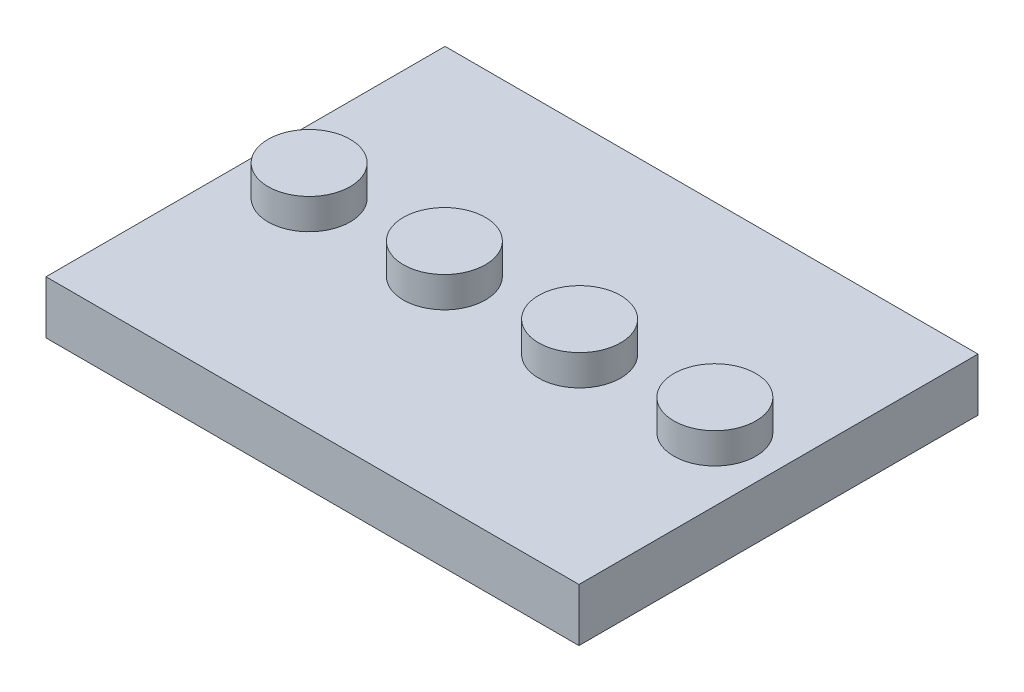
ISO-10303-21;
HEADER;
FILE_DESCRIPTION(('STEP AP214'),'2;1');
FILE_NAME('part.step','',(''),(''),'','','');
FILE_SCHEMA(('AUTOMOTIVE_DESIGN { 1 0 10303 214 1 1 1 1 }'));
ENDSEC;
DATA;
#1=APPLICATION_CONTEXT('core data for automotive mechanical design processes');
#2=APPLICATION_PROTOCOL_DEFINITION('international standard','automotive_design',2000,#1);
#3=PRODUCT_CONTEXT('',#1,'mechanical');
#4=PRODUCT('Part','Part','',(#3));
#5=PRODUCT_RELATED_PRODUCT_CATEGORY('part','',(#4));
#6=PRODUCT_DEFINITION_FORMATION('','',#4);
#7=PRODUCT_DEFINITION_CONTEXT('part definition',#1,'design');
#8=PRODUCT_DEFINITION('design','',#6,#7);
#9=PRODUCT_DEFINITION_SHAPE('','',#8);
#10=(LENGTH_UNIT() NAMED_UNIT(*) SI_UNIT(.MILLI.,.METRE.));
#11=(NAMED_UNIT(*) PLANE_ANGLE_UNIT() SI_UNIT($,.RADIAN.));
#12=(NAMED_UNIT(*) SI_UNIT($,.STERADIAN.) SOLID_ANGLE_UNIT());
#13=UNCERTAINTY_MEASURE_WITH_UNIT(LENGTH_MEASURE(1.E-05),#10,'distance_accuracy_value','');
#14=(GEOMETRIC_REPRESENTATION_CONTEXT(3) GLOBAL_UNCERTAINTY_ASSIGNED_CONTEXT((#13)) GLOBAL_UNIT_ASSIGNED_CONTEXT((#10,
#11,#12)) REPRESENTATION_CONTEXT('',''));
#15=CARTESIAN_POINT('',(0.,0.,0.));
#16=DIRECTION('',(0.,0.,1.));
#17=DIRECTION('',(1.,0.,0.));
#18=AXIS2_PLACEMENT_3D('',#15,#16,#17);
#19=CARTESIAN_POINT('',(15.94,-3.17,-11.935));
#20=DIRECTION('',(1.,0.,0.));
#21=DIRECTION('',(0.,0.,-1.));
#22=AXIS2_PLACEMENT_3D('',#19,#20,#21);
#23=PLANE('',#22);
#24=DIRECTION('',(0.,0.,-1.));
#25=VECTOR('',#24,1.);
#26=CARTESIAN_POINT('',(15.94,0.,-11.935));
#27=LINE('',#26,#25);
#28=CARTESIAN_POINT('',(15.94,0.,11.935));
#29=VERTEX_POINT('',#28);
#30=CARTESIAN_POINT('',(15.94,0.,-11.935));
#31=VERTEX_POINT('',#30);
#32=EDGE_CURVE('E195',#29,#31,#27,.T.);
#33=ORIENTED_EDGE('',*,*,#32,.F.);
#34=DIRECTION('',(0.,1.,0.));
#35=VECTOR('',#34,1.);
#36=CARTESIAN_POINT('',(15.94,-3.17,11.935));
#37=LINE('',#36,#35);
#38=CARTESIAN_POINT('',(15.94,-3.17,11.935));
#39=VERTEX_POINT('',#38);
#40=EDGE_CURVE('E58',#39,#29,#37,.T.);
#41=ORIENTED_EDGE('',*,*,#40,.F.);
#42=DIRECTION('',(0.,0.,-1.));
#43=VECTOR('',#42,1.);
#44=CARTESIAN_POINT('',(15.94,-3.17,-11.935));
#45=LINE('',#44,#43);
#46=CARTESIAN_POINT('',(15.94,-3.17,-11.935));
#47=VERTEX_POINT('',#46);
#48=EDGE_CURVE('E198',#39,#47,#45,.T.);
#49=ORIENTED_EDGE('',*,*,#48,.T.);
#50=DIRECTION('',(0.,1.,0.));
#51=VECTOR('',#50,1.);
#52=CARTESIAN_POINT('',(15.94,-3.17,-11.935));
#53=LINE('',#52,#51);
#54=EDGE_CURVE('E84',#47,#31,#53,.T.);
#55=ORIENTED_EDGE('',*,*,#54,.T.);
#56=EDGE_LOOP('',(#33,#41,#49,#55));
#57=FACE_BOUND('',#56,.T.);
#58=ADVANCED_FACE('F35',(#57),#23,.T.);
#59=CARTESIAN_POINT('',(-15.94,-3.17,11.935));
#60=DIRECTION('',(0.,0.,1.));
#61=DIRECTION('',(1.,0.,0.));
#62=AXIS2_PLACEMENT_3D('',#59,#60,#61);
#63=PLANE('',#62);
#64=DIRECTION('',(1.,0.,0.));
#65=VECTOR('',#64,1.);
#66=CARTESIAN_POINT('',(-15.94,0.,11.935));
#67=LINE('',#66,#65);
#68=CARTESIAN_POINT('',(-15.94,0.,11.935));
#69=VERTEX_POINT('',#68);
#70=EDGE_CURVE('E201',#69,#29,#67,.T.);
#71=ORIENTED_EDGE('',*,*,#70,.F.);
#72=DIRECTION('',(0.,1.,0.));
#73=VECTOR('',#72,1.);
#74=CARTESIAN_POINT('',(-15.94,-3.17,11.935));
#75=LINE('',#74,#73);
#76=CARTESIAN_POINT('',(-15.94,-3.17,11.935));
#77=VERTEX_POINT('',#76);
#78=EDGE_CURVE('E220',#77,#69,#75,.T.);
#79=ORIENTED_EDGE('',*,*,#78,.F.);
#80=DIRECTION('',(1.,0.,0.));
#81=VECTOR('',#80,1.);
#82=CARTESIAN_POINT('',(-15.94,-3.17,11.935));
#83=LINE('',#82,#81);
#84=EDGE_CURVE('E206',#77,#39,#83,.T.);
#85=ORIENTED_EDGE('',*,*,#84,.T.);
#86=ORIENTED_EDGE('',*,*,#40,.T.);
#87=EDGE_LOOP('',(#71,#79,#85,#86));
#88=FACE_BOUND('',#87,.T.);
#89=ADVANCED_FACE('F276',(#88),#63,.T.);
#90=CARTESIAN_POINT('',(-15.94,-3.17,-11.935));
#91=DIRECTION('',(-1.,0.,0.));
#92=DIRECTION('',(0.,0.,1.));
#93=AXIS2_PLACEMENT_3D('',#90,#91,#92);
#94=PLANE('',#93);
#95=DIRECTION('',(0.,0.,1.));
#96=VECTOR('',#95,1.);
#97=CARTESIAN_POINT('',(-15.94,0.,-11.935));
#98=LINE('',#97,#96);
#99=CARTESIAN_POINT('',(-15.94,0.,-11.935));
#100=VERTEX_POINT('',#99);
#101=EDGE_CURVE('E213',#100,#69,#98,.T.);
#102=ORIENTED_EDGE('',*,*,#101,.F.);
#103=DIRECTION('',(0.,1.,0.));
#104=VECTOR('',#103,1.);
#105=CARTESIAN_POINT('',(-15.94,-3.17,-11.935));
#106=LINE('',#105,#104);
#107=CARTESIAN_POINT('',(-15.94,-3.17,-11.935));
#108=VERTEX_POINT('',#107);
#109=EDGE_CURVE('E222',#108,#100,#106,.T.);
#110=ORIENTED_EDGE('',*,*,#109,.F.);
#111=DIRECTION('',(0.,0.,1.));
#112=VECTOR('',#111,1.);
#113=CARTESIAN_POINT('',(-15.94,-3.17,-11.935));
#114=LINE('',#113,#112);
#115=EDGE_CURVE('E203',#108,#77,#114,.T.);
#116=ORIENTED_EDGE('',*,*,#115,.T.);
#117=ORIENTED_EDGE('',*,*,#78,.T.);
#118=EDGE_LOOP('',(#102,#110,#116,#117));
#119=FACE_BOUND('',#118,.T.);
#120=ADVANCED_FACE('F280',(#119),#94,.T.);
#121=CARTESIAN_POINT('',(-15.94,-3.17,-11.935));
#122=DIRECTION('',(0.,0.,-1.));
#123=DIRECTION('',(-1.,0.,0.));
#124=AXIS2_PLACEMENT_3D('',#121,#122,#123);
#125=PLANE('',#124);
#126=DIRECTION('',(-1.,0.,0.));
#127=VECTOR('',#126,1.);
#128=CARTESIAN_POINT('',(-15.94,0.,-11.935));
#129=LINE('',#128,#127);
#130=EDGE_CURVE('E210',#31,#100,#129,.T.);
#131=ORIENTED_EDGE('',*,*,#130,.F.);
#132=ORIENTED_EDGE('',*,*,#54,.F.);
#133=DIRECTION('',(-1.,0.,0.));
#134=VECTOR('',#133,1.);
#135=CARTESIAN_POINT('',(-15.94,-3.17,-11.935));
#136=LINE('',#135,#134);
#137=EDGE_CURVE('E200',#47,#108,#136,.T.);
#138=ORIENTED_EDGE('',*,*,#137,.T.);
#139=ORIENTED_EDGE('',*,*,#109,.T.);
#140=EDGE_LOOP('',(#131,#132,#138,#139));
#141=FACE_BOUND('',#140,.T.);
#142=ADVANCED_FACE('F290',(#141),#125,.T.);
#143=CARTESIAN_POINT('',(0.,-3.17,0.));
#144=DIRECTION('',(0.,1.,0.));
#145=DIRECTION('',(0.,0.,1.));
#146=AXIS2_PLACEMENT_3D('',#143,#144,#145);
#147=PLANE('',#146);
#148=DIRECTION('',(1.,0.,0.));
#149=VECTOR('',#148,1.);
#150=CARTESIAN_POINT('',(0.,-3.17,10.435));
#151=LINE('',#150,#149);
#152=CARTESIAN_POINT('',(-14.44,-3.17,10.435));
#153=VERTEX_POINT('',#152);
#154=CARTESIAN_POINT('',(14.44,-3.17,10.435));
#155=VERTEX_POINT('',#154);
#156=EDGE_CURVE('E169',#153,#155,#151,.T.);
#157=ORIENTED_EDGE('',*,*,#156,.T.);
#158=DIRECTION('',(0.,0.,-1.));
#159=VECTOR('',#158,1.);
#160=CARTESIAN_POINT('',(14.44,-3.17,0.));
#161=LINE('',#160,#159);
#162=CARTESIAN_POINT('',(14.44,-3.17,-10.435));
#163=VERTEX_POINT('',#162);
#164=EDGE_CURVE('E113',#155,#163,#161,.T.);
#165=ORIENTED_EDGE('',*,*,#164,.T.);
#166=DIRECTION('',(-1.,0.,0.));
#167=VECTOR('',#166,1.);
#168=CARTESIAN_POINT('',(0.,-3.17,-10.435));
#169=LINE('',#168,#167);
#170=CARTESIAN_POINT('',(-14.44,-3.17,-10.435));
#171=VERTEX_POINT('',#170);
#172=EDGE_CURVE('E135',#163,#171,#169,.T.);
#173=ORIENTED_EDGE('',*,*,#172,.T.);
#174=DIRECTION('',(0.,0.,1.));
#175=VECTOR('',#174,1.);
#176=CARTESIAN_POINT('',(-14.44,-3.17,0.));
#177=LINE('',#176,#175);
#178=EDGE_CURVE('E49',#171,#153,#177,.T.);
#179=ORIENTED_EDGE('',*,*,#178,.T.);
#180=EDGE_LOOP('',(#157,#165,#173,#179));
#181=FACE_BOUND('',#180,.T.);
#182=ORIENTED_EDGE('',*,*,#48,.F.);
#183=ORIENTED_EDGE('',*,*,#84,.F.);
#184=ORIENTED_EDGE('',*,*,#115,.F.);
#185=ORIENTED_EDGE('',*,*,#137,.F.);
#186=EDGE_LOOP('',(#182,#183,#184,#185));
#187=FACE_BOUND('',#186,.T.);
#188=ADVANCED_FACE('F289',(#181,#187),#147,.F.);
#189=CARTESIAN_POINT('',(0.,0.,0.));
#190=DIRECTION('',(0.,1.,0.));
#191=DIRECTION('',(0.,0.,1.));
#192=AXIS2_PLACEMENT_3D('',#189,#190,#191);
#193=PLANE('',#192);
#194=CARTESIAN_POINT('',(12.135,0.,0.));
#195=DIRECTION('',(0.,1.,0.));
#196=DIRECTION('',(0.,0.,1.));
#197=AXIS2_PLACEMENT_3D('',#194,#195,#196);
#198=CIRCLE('',#197,2.455);
#199=CARTESIAN_POINT('',(12.135,0.,2.455));
#200=VERTEX_POINT('',#199);
#201=EDGE_CURVE('E118',#200,#200,#198,.T.);
#202=ORIENTED_EDGE('',*,*,#201,.F.);
#203=EDGE_LOOP('',(#202));
#204=FACE_BOUND('',#203,.T.);
#205=CARTESIAN_POINT('',(4.045,0.,0.));
#206=DIRECTION('',(0.,1.,0.));
#207=DIRECTION('',(0.,0.,1.));
#208=AXIS2_PLACEMENT_3D('',#205,#206,#207);
#209=CIRCLE('',#208,2.455);
#210=CARTESIAN_POINT('',(4.045,0.,2.455));
#211=VERTEX_POINT('',#210);
#212=EDGE_CURVE('E177',#211,#211,#209,.T.);
#213=ORIENTED_EDGE('',*,*,#212,.F.);
#214=EDGE_LOOP('',(#213));
#215=FACE_BOUND('',#214,.T.);
#216=CARTESIAN_POINT('',(-4.045,0.,0.));
#217=DIRECTION('',(0.,1.,0.));
#218=DIRECTION('',(0.,0.,1.));
#219=AXIS2_PLACEMENT_3D('',#216,#217,#218);
#220=CIRCLE('',#219,2.455);
#221=CARTESIAN_POINT('',(-4.045,0.,2.455));
#222=VERTEX_POINT('',#221);
#223=EDGE_CURVE('E183',#222,#222,#220,.T.);
#224=ORIENTED_EDGE('',*,*,#223,.F.);
#225=EDGE_LOOP('',(#224));
#226=FACE_BOUND('',#225,.T.);
#227=CARTESIAN_POINT('',(-12.135,0.,0.));
#228=DIRECTION('',(0.,1.,0.));
#229=DIRECTION('',(0.,0.,1.));
#230=AXIS2_PLACEMENT_3D('',#227,#228,#229);
#231=CIRCLE('',#230,2.455);
#232=CARTESIAN_POINT('',(-12.135,0.,2.455));
#233=VERTEX_POINT('',#232);
#234=EDGE_CURVE('E189',#233,#233,#231,.T.);
#235=ORIENTED_EDGE('',*,*,#234,.F.);
#236=EDGE_LOOP('',(#235));
#237=FACE_BOUND('',#236,.T.);
#238=ORIENTED_EDGE('',*,*,#32,.T.);
#239=ORIENTED_EDGE('',*,*,#130,.T.);
#240=ORIENTED_EDGE('',*,*,#101,.T.);
#241=ORIENTED_EDGE('',*,*,#70,.T.);
#242=EDGE_LOOP('',(#238,#239,#240,#241));
#243=FACE_BOUND('',#242,.T.);
#244=ADVANCED_FACE('F283',(#204,#215,#226,#237,#243),#193,.T.);
#245=CARTESIAN_POINT('',(-12.135,1.83,0.));
#246=DIRECTION('',(0.,-1.,0.));
#247=DIRECTION('',(0.,0.,-1.));
#248=AXIS2_PLACEMENT_3D('',#245,#246,#247);
#249=CYLINDRICAL_SURFACE('',#248,2.455);
#250=CARTESIAN_POINT('',(-12.135,1.83,0.));
#251=DIRECTION('',(0.,1.,0.));
#252=DIRECTION('',(0.,0.,1.));
#253=AXIS2_PLACEMENT_3D('',#250,#251,#252);
#254=CIRCLE('',#253,2.455);
#255=CARTESIAN_POINT('',(-12.135,1.83,2.455));
#256=VERTEX_POINT('',#255);
#257=EDGE_CURVE('E192',#256,#256,#254,.T.);
#258=ORIENTED_EDGE('',*,*,#257,.F.);
#259=EDGE_LOOP('',(#258));
#260=FACE_BOUND('',#259,.T.);
#261=ORIENTED_EDGE('',*,*,#234,.T.);
#262=EDGE_LOOP('',(#261));
#263=FACE_BOUND('',#262,.T.);
#264=ADVANCED_FACE('F301',(#260,#263),#249,.T.);
#265=CARTESIAN_POINT('',(-12.135,1.83,0.));
#266=DIRECTION('',(0.,1.,0.));
#267=DIRECTION('',(0.,0.,1.));
#268=AXIS2_PLACEMENT_3D('',#265,#266,#267);
#269=PLANE('',#268);
#270=ORIENTED_EDGE('',*,*,#257,.T.);
#271=EDGE_LOOP('',(#270));
#272=FACE_BOUND('',#271,.T.);
#273=ADVANCED_FACE('F306',(#272),#269,.T.);
#274=CARTESIAN_POINT('',(-4.045,1.83,0.));
#275=DIRECTION('',(0.,-1.,0.));
#276=DIRECTION('',(0.,0.,-1.));
#277=AXIS2_PLACEMENT_3D('',#274,#275,#276);
#278=CYLINDRICAL_SURFACE('',#277,2.455);
#279=CARTESIAN_POINT('',(-4.045,1.83,0.));
#280=DIRECTION('',(0.,1.,0.));
#281=DIRECTION('',(0.,0.,1.));
#282=AXIS2_PLACEMENT_3D('',#279,#280,#281);
#283=CIRCLE('',#282,2.455);
#284=CARTESIAN_POINT('',(-4.045,1.83,2.455));
#285=VERTEX_POINT('',#284);
#286=EDGE_CURVE('E186',#285,#285,#283,.T.);
#287=ORIENTED_EDGE('',*,*,#286,.F.);
#288=EDGE_LOOP('',(#287));
#289=FACE_BOUND('',#288,.T.);
#290=ORIENTED_EDGE('',*,*,#223,.T.);
#291=EDGE_LOOP('',(#290));
#292=FACE_BOUND('',#291,.T.);
#293=ADVANCED_FACE('F310',(#289,#292),#278,.T.);
#294=CARTESIAN_POINT('',(-4.045,1.83,0.));
#295=DIRECTION('',(0.,1.,0.));
#296=DIRECTION('',(0.,0.,1.));
#297=AXIS2_PLACEMENT_3D('',#294,#295,#296);
#298=PLANE('',#297);
#299=ORIENTED_EDGE('',*,*,#286,.T.);
#300=EDGE_LOOP('',(#299));
#301=FACE_BOUND('',#300,.T.);
#302=ADVANCED_FACE('F314',(#301),#298,.T.);
#303=CARTESIAN_POINT('',(4.045,1.83,0.));
#304=DIRECTION('',(0.,-1.,0.));
#305=DIRECTION('',(0.,0.,-1.));
#306=AXIS2_PLACEMENT_3D('',#303,#304,#305);
#307=CYLINDRICAL_SURFACE('',#306,2.455);
#308=CARTESIAN_POINT('',(4.045,1.83,0.));
#309=DIRECTION('',(0.,1.,0.));
#310=DIRECTION('',(0.,0.,1.));
#311=AXIS2_PLACEMENT_3D('',#308,#309,#310);
#312=CIRCLE('',#311,2.455);
#313=CARTESIAN_POINT('',(4.045,1.83,2.455));
#314=VERTEX_POINT('',#313);
#315=EDGE_CURVE('E180',#314,#314,#312,.T.);
#316=ORIENTED_EDGE('',*,*,#315,.F.);
#317=EDGE_LOOP('',(#316));
#318=FACE_BOUND('',#317,.T.);
#319=ORIENTED_EDGE('',*,*,#212,.T.);
#320=EDGE_LOOP('',(#319));
#321=FACE_BOUND('',#320,.T.);
#322=ADVANCED_FACE('F318',(#318,#321),#307,.T.);
#323=CARTESIAN_POINT('',(4.045,1.83,0.));
#324=DIRECTION('',(0.,1.,0.));
#325=DIRECTION('',(0.,0.,1.));
#326=AXIS2_PLACEMENT_3D('',#323,#324,#325);
#327=PLANE('',#326);
#328=ORIENTED_EDGE('',*,*,#315,.T.);
#329=EDGE_LOOP('',(#328));
#330=FACE_BOUND('',#329,.T.);
#331=ADVANCED_FACE('F322',(#330),#327,.T.);
#332=CARTESIAN_POINT('',(12.135,1.83,0.));
#333=DIRECTION('',(0.,-1.,0.));
#334=DIRECTION('',(0.,0.,-1.));
#335=AXIS2_PLACEMENT_3D('',#332,#333,#334);
#336=CYLINDRICAL_SURFACE('',#335,2.455);
#337=CARTESIAN_POINT('',(12.135,1.83,0.));
#338=DIRECTION('',(0.,1.,0.));
#339=DIRECTION('',(0.,0.,1.));
#340=AXIS2_PLACEMENT_3D('',#337,#338,#339);
#341=CIRCLE('',#340,2.455);
#342=CARTESIAN_POINT('',(12.135,1.83,2.455));
#343=VERTEX_POINT('',#342);
#344=EDGE_CURVE('E174',#343,#343,#341,.T.);
#345=ORIENTED_EDGE('',*,*,#344,.F.);
#346=EDGE_LOOP('',(#345));
#347=FACE_BOUND('',#346,.T.);
#348=ORIENTED_EDGE('',*,*,#201,.T.);
#349=EDGE_LOOP('',(#348));
#350=FACE_BOUND('',#349,.T.);
#351=ADVANCED_FACE('F326',(#347,#350),#336,.T.);
#352=CARTESIAN_POINT('',(12.135,1.83,0.));
#353=DIRECTION('',(0.,1.,0.));
#354=DIRECTION('',(0.,0.,1.));
#355=AXIS2_PLACEMENT_3D('',#352,#353,#354);
#356=PLANE('',#355);
#357=ORIENTED_EDGE('',*,*,#344,.T.);
#358=EDGE_LOOP('',(#357));
#359=FACE_BOUND('',#358,.T.);
#360=ADVANCED_FACE('F330',(#359),#356,.T.);
#361=CARTESIAN_POINT('',(14.44,-3.17,-11.935));
#362=DIRECTION('',(1.,0.,0.));
#363=DIRECTION('',(0.,0.,-1.));
#364=AXIS2_PLACEMENT_3D('',#361,#362,#363);
#365=PLANE('',#364);
#366=DIRECTION('',(0.,0.,-1.));
#367=VECTOR('',#366,1.);
#368=CARTESIAN_POINT('',(14.44,-1.5,0.));
#369=LINE('',#368,#367);
#370=CARTESIAN_POINT('',(14.44,-1.5,10.435));
#371=VERTEX_POINT('',#370);
#372=CARTESIAN_POINT('',(14.44,-1.5,-10.435));
#373=VERTEX_POINT('',#372);
#374=EDGE_CURVE('E111',#371,#373,#369,.T.);
#375=ORIENTED_EDGE('',*,*,#374,.T.);
#376=DIRECTION('',(0.,1.,0.));
#377=VECTOR('',#376,1.);
#378=CARTESIAN_POINT('',(14.44,-3.17,-10.435));
#379=LINE('',#378,#377);
#380=EDGE_CURVE('E140',#163,#373,#379,.T.);
#381=ORIENTED_EDGE('',*,*,#380,.F.);
#382=ORIENTED_EDGE('',*,*,#164,.F.);
#383=DIRECTION('',(0.,1.,0.));
#384=VECTOR('',#383,1.);
#385=CARTESIAN_POINT('',(14.44,-3.17,10.435));
#386=LINE('',#385,#384);
#387=EDGE_CURVE('E108',#155,#371,#386,.T.);
#388=ORIENTED_EDGE('',*,*,#387,.T.);
#389=EDGE_LOOP('',(#375,#381,#382,#388));
#390=FACE_BOUND('',#389,.T.);
#391=ADVANCED_FACE('F110',(#390),#365,.F.);
#392=CARTESIAN_POINT('',(-15.94,-3.17,10.435));
#393=DIRECTION('',(0.,0.,1.));
#394=DIRECTION('',(1.,0.,0.));
#395=AXIS2_PLACEMENT_3D('',#392,#393,#394);
#396=PLANE('',#395);
#397=DIRECTION('',(1.,0.,0.));
#398=VECTOR('',#397,1.);
#399=CARTESIAN_POINT('',(0.,-1.5,10.435));
#400=LINE('',#399,#398);
#401=CARTESIAN_POINT('',(-14.44,-1.5,10.435));
#402=VERTEX_POINT('',#401);
#403=EDGE_CURVE('E126',#402,#371,#400,.T.);
#404=ORIENTED_EDGE('',*,*,#403,.T.);
#405=ORIENTED_EDGE('',*,*,#387,.F.);
#406=ORIENTED_EDGE('',*,*,#156,.F.);
#407=DIRECTION('',(0.,1.,0.));
#408=VECTOR('',#407,1.);
#409=CARTESIAN_POINT('',(-14.44,-3.17,10.435));
#410=LINE('',#409,#408);
#411=EDGE_CURVE('E119',#153,#402,#410,.T.);
#412=ORIENTED_EDGE('',*,*,#411,.T.);
#413=EDGE_LOOP('',(#404,#405,#406,#412));
#414=FACE_BOUND('',#413,.T.);
#415=ADVANCED_FACE('F131',(#414),#396,.F.);
#416=CARTESIAN_POINT('',(-14.44,-3.17,-11.935));
#417=DIRECTION('',(-1.,0.,0.));
#418=DIRECTION('',(0.,0.,1.));
#419=AXIS2_PLACEMENT_3D('',#416,#417,#418);
#420=PLANE('',#419);
#421=DIRECTION('',(0.,0.,1.));
#422=VECTOR('',#421,1.);
#423=CARTESIAN_POINT('',(-14.44,-1.5,0.));
#424=LINE('',#423,#422);
#425=CARTESIAN_POINT('',(-14.44,-1.5,-10.435));
#426=VERTEX_POINT('',#425);
#427=EDGE_CURVE('E133',#426,#402,#424,.T.);
#428=ORIENTED_EDGE('',*,*,#427,.T.);
#429=ORIENTED_EDGE('',*,*,#411,.F.);
#430=ORIENTED_EDGE('',*,*,#178,.F.);
#431=DIRECTION('',(0.,1.,0.));
#432=VECTOR('',#431,1.);
#433=CARTESIAN_POINT('',(-14.44,-3.17,-10.435));
#434=LINE('',#433,#432);
#435=EDGE_CURVE('E141',#171,#426,#434,.T.);
#436=ORIENTED_EDGE('',*,*,#435,.T.);
#437=EDGE_LOOP('',(#428,#429,#430,#436));
#438=FACE_BOUND('',#437,.T.);
#439=ADVANCED_FACE('F618',(#438),#420,.F.);
#440=CARTESIAN_POINT('',(-15.94,-3.17,-10.435));
#441=DIRECTION('',(0.,0.,-1.));
#442=DIRECTION('',(-1.,0.,0.));
#443=AXIS2_PLACEMENT_3D('',#440,#441,#442);
#444=PLANE('',#443);
#445=DIRECTION('',(-1.,0.,0.));
#446=VECTOR('',#445,1.);
#447=CARTESIAN_POINT('',(0.,-1.5,-10.435));
#448=LINE('',#447,#446);
#449=EDGE_CURVE('E128',#373,#426,#448,.T.);
#450=ORIENTED_EDGE('',*,*,#449,.T.);
#451=ORIENTED_EDGE('',*,*,#435,.F.);
#452=ORIENTED_EDGE('',*,*,#172,.F.);
#453=ORIENTED_EDGE('',*,*,#380,.T.);
#454=EDGE_LOOP('',(#450,#451,#452,#453));
#455=FACE_BOUND('',#454,.T.);
#456=ADVANCED_FACE('F243',(#455),#444,.F.);
#457=CARTESIAN_POINT('',(0.,-1.5,0.));
#458=DIRECTION('',(0.,1.,0.));
#459=DIRECTION('',(0.,0.,1.));
#460=AXIS2_PLACEMENT_3D('',#457,#458,#459);
#461=PLANE('',#460);
#462=CARTESIAN_POINT('',(-7.96999999999999,-1.5,-3.98166666666666));
#463=DIRECTION('',(0.,1.,0.));
#464=DIRECTION('',(0.,0.,1.));
#465=AXIS2_PLACEMENT_3D('',#462,#463,#464);
#466=CIRCLE('',#465,3.24);
#467=CARTESIAN_POINT('',(-7.96999999999999,-1.5,-0.741666666666664));
#468=VERTEX_POINT('',#467);
#469=EDGE_CURVE('E12',#468,#468,#466,.F.);
#470=ORIENTED_EDGE('',*,*,#469,.F.);
#471=EDGE_LOOP('',(#470));
#472=FACE_BOUND('',#471,.T.);
#473=CARTESIAN_POINT('',(7.97000000000001,-1.5,-3.98166666666666));
#474=DIRECTION('',(0.,1.,0.));
#475=DIRECTION('',(0.,0.,1.));
#476=AXIS2_PLACEMENT_3D('',#473,#474,#475);
#477=CIRCLE('',#476,3.24);
#478=CARTESIAN_POINT('',(7.97000000000001,-1.5,-0.741666666666664));
#479=VERTEX_POINT('',#478);
#480=EDGE_CURVE('E42',#479,#479,#477,.F.);
#481=ORIENTED_EDGE('',*,*,#480,.F.);
#482=EDGE_LOOP('',(#481));
#483=FACE_BOUND('',#482,.T.);
#484=CARTESIAN_POINT('',(0.,-1.5,-3.98166666666666));
#485=DIRECTION('',(0.,1.,0.));
#486=DIRECTION('',(0.,0.,1.));
#487=AXIS2_PLACEMENT_3D('',#484,#485,#486);
#488=CIRCLE('',#487,3.24);
#489=CARTESIAN_POINT('',(0.,-1.5,-0.741666666666664));
#490=VERTEX_POINT('',#489);
#491=EDGE_CURVE('E233',#490,#490,#488,.F.);
#492=ORIENTED_EDGE('',*,*,#491,.F.);
#493=EDGE_LOOP('',(#492));
#494=FACE_BOUND('',#493,.T.);
#495=CARTESIAN_POINT('',(7.97000000000001,-1.5,3.97833333333334));
#496=DIRECTION('',(0.,1.,0.));
#497=DIRECTION('',(0.,0.,1.));
#498=AXIS2_PLACEMENT_3D('',#495,#496,#497);
#499=CIRCLE('',#498,3.24);
#500=CARTESIAN_POINT('',(7.97000000000001,-1.5,7.21833333333334));
#501=VERTEX_POINT('',#500);
#502=EDGE_CURVE('E230',#501,#501,#499,.F.);
#503=ORIENTED_EDGE('',*,*,#502,.F.);
#504=EDGE_LOOP('',(#503));
#505=FACE_BOUND('',#504,.T.);
#506=CARTESIAN_POINT('',(0.,-1.5,3.97833333333334));
#507=DIRECTION('',(0.,1.,0.));
#508=DIRECTION('',(0.,0.,1.));
#509=AXIS2_PLACEMENT_3D('',#506,#507,#508);
#510=CIRCLE('',#509,3.24);
#511=CARTESIAN_POINT('',(0.,-1.5,7.21833333333334));
#512=VERTEX_POINT('',#511);
#513=EDGE_CURVE('E227',#512,#512,#510,.F.);
#514=ORIENTED_EDGE('',*,*,#513,.F.);
#515=EDGE_LOOP('',(#514));
#516=FACE_BOUND('',#515,.T.);
#517=CARTESIAN_POINT('',(-7.96999999999999,-1.5,3.97833333333334));
#518=DIRECTION('',(0.,1.,0.));
#519=DIRECTION('',(0.,0.,1.));
#520=AXIS2_PLACEMENT_3D('',#517,#518,#519);
#521=CIRCLE('',#520,3.24);
#522=CARTESIAN_POINT('',(-7.96999999999999,-1.5,7.21833333333334));
#523=VERTEX_POINT('',#522);
#524=EDGE_CURVE('E219',#523,#523,#521,.F.);
#525=ORIENTED_EDGE('',*,*,#524,.F.);
#526=EDGE_LOOP('',(#525));
#527=FACE_BOUND('',#526,.T.);
#528=CARTESIAN_POINT('',(12.135,-1.5,0.));
#529=DIRECTION('',(0.,1.,0.));
#530=DIRECTION('',(0.,0.,1.));
#531=AXIS2_PLACEMENT_3D('',#528,#529,#530);
#532=CIRCLE('',#531,0.955);
#533=CARTESIAN_POINT('',(12.135,-1.5,0.955));
#534=VERTEX_POINT('',#533);
#535=EDGE_CURVE('E145',#534,#534,#532,.T.);
#536=ORIENTED_EDGE('',*,*,#535,.T.);
#537=EDGE_LOOP('',(#536));
#538=FACE_BOUND('',#537,.T.);
#539=CARTESIAN_POINT('',(4.045,-1.5,0.));
#540=DIRECTION('',(0.,1.,0.));
#541=DIRECTION('',(0.,0.,1.));
#542=AXIS2_PLACEMENT_3D('',#539,#540,#541);
#543=CIRCLE('',#542,0.955);
#544=CARTESIAN_POINT('',(4.045,-1.5,0.955));
#545=VERTEX_POINT('',#544);
#546=EDGE_CURVE('E150',#545,#545,#543,.T.);
#547=ORIENTED_EDGE('',*,*,#546,.T.);
#548=EDGE_LOOP('',(#547));
#549=FACE_BOUND('',#548,.T.);
#550=CARTESIAN_POINT('',(-4.045,-1.5,0.));
#551=DIRECTION('',(0.,1.,0.));
#552=DIRECTION('',(0.,0.,1.));
#553=AXIS2_PLACEMENT_3D('',#550,#551,#552);
#554=CIRCLE('',#553,0.955);
#555=CARTESIAN_POINT('',(-4.045,-1.5,0.955));
#556=VERTEX_POINT('',#555);
#557=EDGE_CURVE('E154',#556,#556,#554,.T.);
#558=ORIENTED_EDGE('',*,*,#557,.T.);
#559=EDGE_LOOP('',(#558));
#560=FACE_BOUND('',#559,.T.);
#561=CARTESIAN_POINT('',(-12.135,-1.5,0.));
#562=DIRECTION('',(0.,1.,0.));
#563=DIRECTION('',(0.,0.,1.));
#564=AXIS2_PLACEMENT_3D('',#561,#562,#563);
#565=CIRCLE('',#564,0.955000000000003);
#566=CARTESIAN_POINT('',(-12.135,-1.5,0.955000000000003));
#567=VERTEX_POINT('',#566);
#568=EDGE_CURVE('E158',#567,#567,#565,.T.);
#569=ORIENTED_EDGE('',*,*,#568,.T.);
#570=EDGE_LOOP('',(#569));
#571=FACE_BOUND('',#570,.T.);
#572=ORIENTED_EDGE('',*,*,#374,.F.);
#573=ORIENTED_EDGE('',*,*,#403,.F.);
#574=ORIENTED_EDGE('',*,*,#427,.F.);
#575=ORIENTED_EDGE('',*,*,#449,.F.);
#576=EDGE_LOOP('',(#572,#573,#574,#575));
#577=FACE_BOUND('',#576,.T.);
#578=ADVANCED_FACE('F124',(#472,#483,#494,#505,#516,#527,#538,#549,#560,#571,#577),#461,.F.);
#579=CARTESIAN_POINT('',(-12.135,1.83,0.));
#580=DIRECTION('',(0.,-1.,0.));
#581=DIRECTION('',(0.,0.,-1.));
#582=AXIS2_PLACEMENT_3D('',#579,#580,#581);
#583=CYLINDRICAL_SURFACE('',#582,0.955000000000003);
#584=CARTESIAN_POINT('',(-12.135,0.33,0.));
#585=DIRECTION('',(0.,1.,0.));
#586=DIRECTION('',(0.,0.,1.));
#587=AXIS2_PLACEMENT_3D('',#584,#585,#586);
#588=CIRCLE('',#587,0.955000000000003);
#589=CARTESIAN_POINT('',(-12.135,0.33,0.955000000000003));
#590=VERTEX_POINT('',#589);
#591=EDGE_CURVE('E129',#590,#590,#588,.T.);
#592=ORIENTED_EDGE('',*,*,#591,.T.);
#593=EDGE_LOOP('',(#592));
#594=FACE_BOUND('',#593,.T.);
#595=ORIENTED_EDGE('',*,*,#568,.F.);
#596=EDGE_LOOP('',(#595));
#597=FACE_BOUND('',#596,.T.);
#598=ADVANCED_FACE('F242',(#594,#597),#583,.F.);
#599=CARTESIAN_POINT('',(-12.135,0.33,0.));
#600=DIRECTION('',(0.,1.,0.));
#601=DIRECTION('',(0.,0.,1.));
#602=AXIS2_PLACEMENT_3D('',#599,#600,#601);
#603=PLANE('',#602);
#604=ORIENTED_EDGE('',*,*,#591,.F.);
#605=EDGE_LOOP('',(#604));
#606=FACE_BOUND('',#605,.T.);
#607=ADVANCED_FACE('F265',(#606),#603,.F.);
#608=CARTESIAN_POINT('',(-4.045,1.83,0.));
#609=DIRECTION('',(0.,-1.,0.));
#610=DIRECTION('',(0.,0.,-1.));
#611=AXIS2_PLACEMENT_3D('',#608,#609,#610);
#612=CYLINDRICAL_SURFACE('',#611,0.955);
#613=CARTESIAN_POINT('',(-4.045,0.33,0.));
#614=DIRECTION('',(0.,1.,0.));
#615=DIRECTION('',(0.,0.,1.));
#616=AXIS2_PLACEMENT_3D('',#613,#614,#615);
#617=CIRCLE('',#616,0.955);
#618=CARTESIAN_POINT('',(-4.045,0.33,0.955));
#619=VERTEX_POINT('',#618);
#620=EDGE_CURVE('E157',#619,#619,#617,.T.);
#621=ORIENTED_EDGE('',*,*,#620,.T.);
#622=EDGE_LOOP('',(#621));
#623=FACE_BOUND('',#622,.T.);
#624=ORIENTED_EDGE('',*,*,#557,.F.);
#625=EDGE_LOOP('',(#624));
#626=FACE_BOUND('',#625,.T.);
#627=ADVANCED_FACE('F272',(#623,#626),#612,.F.);
#628=CARTESIAN_POINT('',(-4.045,0.33,0.));
#629=DIRECTION('',(0.,1.,0.));
#630=DIRECTION('',(0.,0.,1.));
#631=AXIS2_PLACEMENT_3D('',#628,#629,#630);
#632=PLANE('',#631);
#633=ORIENTED_EDGE('',*,*,#620,.F.);
#634=EDGE_LOOP('',(#633));
#635=FACE_BOUND('',#634,.T.);
#636=ADVANCED_FACE('F351',(#635),#632,.F.);
#637=CARTESIAN_POINT('',(4.045,1.83,0.));
#638=DIRECTION('',(0.,-1.,0.));
#639=DIRECTION('',(0.,0.,-1.));
#640=AXIS2_PLACEMENT_3D('',#637,#638,#639);
#641=CYLINDRICAL_SURFACE('',#640,0.955);
#642=CARTESIAN_POINT('',(4.045,0.33,0.));
#643=DIRECTION('',(0.,1.,0.));
#644=DIRECTION('',(0.,0.,1.));
#645=AXIS2_PLACEMENT_3D('',#642,#643,#644);
#646=CIRCLE('',#645,0.955);
#647=CARTESIAN_POINT('',(4.045,0.33,0.955));
#648=VERTEX_POINT('',#647);
#649=EDGE_CURVE('E153',#648,#648,#646,.T.);
#650=ORIENTED_EDGE('',*,*,#649,.T.);
#651=EDGE_LOOP('',(#650));
#652=FACE_BOUND('',#651,.T.);
#653=ORIENTED_EDGE('',*,*,#546,.F.);
#654=EDGE_LOOP('',(#653));
#655=FACE_BOUND('',#654,.T.);
#656=ADVANCED_FACE('F347',(#652,#655),#641,.F.);
#657=CARTESIAN_POINT('',(4.045,0.33,0.));
#658=DIRECTION('',(0.,1.,0.));
#659=DIRECTION('',(0.,0.,1.));
#660=AXIS2_PLACEMENT_3D('',#657,#658,#659);
#661=PLANE('',#660);
#662=ORIENTED_EDGE('',*,*,#649,.F.);
#663=EDGE_LOOP('',(#662));
#664=FACE_BOUND('',#663,.T.);
#665=ADVANCED_FACE('F343',(#664),#661,.F.);
#666=CARTESIAN_POINT('',(12.135,1.83,0.));
#667=DIRECTION('',(0.,-1.,0.));
#668=DIRECTION('',(0.,0.,-1.));
#669=AXIS2_PLACEMENT_3D('',#666,#667,#668);
#670=CYLINDRICAL_SURFACE('',#669,0.955);
#671=CARTESIAN_POINT('',(12.135,0.33,0.));
#672=DIRECTION('',(0.,1.,0.));
#673=DIRECTION('',(0.,0.,1.));
#674=AXIS2_PLACEMENT_3D('',#671,#672,#673);
#675=CIRCLE('',#674,0.955);
#676=CARTESIAN_POINT('',(12.135,0.33,0.955));
#677=VERTEX_POINT('',#676);
#678=EDGE_CURVE('E148',#677,#677,#675,.T.);
#679=ORIENTED_EDGE('',*,*,#678,.T.);
#680=EDGE_LOOP('',(#679));
#681=FACE_BOUND('',#680,.T.);
#682=ORIENTED_EDGE('',*,*,#535,.F.);
#683=EDGE_LOOP('',(#682));
#684=FACE_BOUND('',#683,.T.);
#685=ADVANCED_FACE('F339',(#681,#684),#670,.F.);
#686=CARTESIAN_POINT('',(12.135,0.33,0.));
#687=DIRECTION('',(0.,1.,0.));
#688=DIRECTION('',(0.,0.,1.));
#689=AXIS2_PLACEMENT_3D('',#686,#687,#688);
#690=PLANE('',#689);
#691=ORIENTED_EDGE('',*,*,#678,.F.);
#692=EDGE_LOOP('',(#691));
#693=FACE_BOUND('',#692,.T.);
#694=ADVANCED_FACE('F335',(#693),#690,.F.);
#695=CARTESIAN_POINT('',(-7.96999999999999,-12.3341038841777,3.97833333333334));
#696=DIRECTION('',(0.,1.,0.));
#697=DIRECTION('',(0.,0.,1.));
#698=AXIS2_PLACEMENT_3D('',#695,#696,#697);
#699=CYLINDRICAL_SURFACE('',#698,3.24);
#700=CARTESIAN_POINT('',(-7.96999999999999,-2.97,3.97833333333334));
#701=DIRECTION('',(0.,1.,0.));
#702=DIRECTION('',(0.,0.,1.));
#703=AXIS2_PLACEMENT_3D('',#700,#701,#702);
#704=CIRCLE('',#703,3.24);
#705=CARTESIAN_POINT('',(-7.96999999999999,-2.97,7.21833333333334));
#706=VERTEX_POINT('',#705);
#707=EDGE_CURVE('E803',#706,#706,#704,.T.);
#708=ORIENTED_EDGE('',*,*,#707,.T.);
#709=EDGE_LOOP('',(#708));
#710=FACE_BOUND('',#709,.T.);
#711=ORIENTED_EDGE('',*,*,#524,.T.);
#712=EDGE_LOOP('',(#711));
#713=FACE_BOUND('',#712,.T.);
#714=ADVANCED_FACE('F338',(#710,#713),#699,.T.);
#715=CARTESIAN_POINT('',(-7.96999999999999,-12.3341038841777,3.97833333333334));
#716=DIRECTION('',(0.,1.,0.));
#717=DIRECTION('',(0.,0.,1.));
#718=AXIS2_PLACEMENT_3D('',#715,#716,#717);
#719=CYLINDRICAL_SURFACE('',#718,2.41);
#720=CARTESIAN_POINT('',(-7.96999999999999,-2.97,3.97833333333334));
#721=DIRECTION('',(0.,1.,0.));
#722=DIRECTION('',(0.,0.,1.));
#723=AXIS2_PLACEMENT_3D('',#720,#721,#722);
#724=CIRCLE('',#723,2.41);
#725=CARTESIAN_POINT('',(-7.96999999999999,-2.97,6.38833333333334));
#726=VERTEX_POINT('',#725);
#727=EDGE_CURVE('E149',#726,#726,#724,.T.);
#728=ORIENTED_EDGE('',*,*,#727,.F.);
#729=EDGE_LOOP('',(#728));
#730=FACE_BOUND('',#729,.T.);
#731=CARTESIAN_POINT('',(-7.96999999999999,-1.5,3.97833333333334));
#732=DIRECTION('',(0.,-1.,0.));
#733=DIRECTION('',(0.,0.,-1.));
#734=AXIS2_PLACEMENT_3D('',#731,#732,#733);
#735=CIRCLE('',#734,2.41);
#736=CARTESIAN_POINT('',(-7.96999999999999,-1.5,1.56833333333333));
#737=VERTEX_POINT('',#736);
#738=EDGE_CURVE('E800',#737,#737,#735,.T.);
#739=ORIENTED_EDGE('',*,*,#738,.F.);
#740=EDGE_LOOP('',(#739));
#741=FACE_BOUND('',#740,.T.);
#742=ADVANCED_FACE('F447',(#730,#741),#719,.F.);
#743=CARTESIAN_POINT('',(0.,-2.97,0.));
#744=DIRECTION('',(0.,1.,0.));
#745=DIRECTION('',(0.,0.,1.));
#746=AXIS2_PLACEMENT_3D('',#743,#744,#745);
#747=PLANE('',#746);
#748=ORIENTED_EDGE('',*,*,#727,.T.);
#749=EDGE_LOOP('',(#748));
#750=FACE_BOUND('',#749,.T.);
#751=ORIENTED_EDGE('',*,*,#707,.F.);
#752=EDGE_LOOP('',(#751));
#753=FACE_BOUND('',#752,.T.);
#754=ADVANCED_FACE('F392',(#750,#753),#747,.F.);
#755=ORIENTED_EDGE('',*,*,#738,.T.);
#756=EDGE_LOOP('',(#755));
#757=FACE_BOUND('',#756,.T.);
#758=ADVANCED_FACE('F247',(#757),#461,.F.);
#759=CARTESIAN_POINT('',(0.,-12.3341038841777,3.97833333333334));
#760=DIRECTION('',(0.,1.,0.));
#761=DIRECTION('',(0.,0.,1.));
#762=AXIS2_PLACEMENT_3D('',#759,#760,#761);
#763=CYLINDRICAL_SURFACE('',#762,3.24);
#764=CARTESIAN_POINT('',(0.,-2.97,3.97833333333334));
#765=DIRECTION('',(0.,1.,0.));
#766=DIRECTION('',(0.,0.,1.));
#767=AXIS2_PLACEMENT_3D('',#764,#765,#766);
#768=CIRCLE('',#767,3.24);
#769=CARTESIAN_POINT('',(0.,-2.97,7.21833333333334));
#770=VERTEX_POINT('',#769);
#771=EDGE_CURVE('E794',#770,#770,#768,.T.);
#772=ORIENTED_EDGE('',*,*,#771,.T.);
#773=EDGE_LOOP('',(#772));
#774=FACE_BOUND('',#773,.T.);
#775=ORIENTED_EDGE('',*,*,#513,.T.);
#776=EDGE_LOOP('',(#775));
#777=FACE_BOUND('',#776,.T.);
#778=ADVANCED_FACE('F391',(#774,#777),#763,.T.);
#779=CARTESIAN_POINT('',(0.,-12.3341038841777,3.97833333333334));
#780=DIRECTION('',(0.,1.,0.));
#781=DIRECTION('',(0.,0.,1.));
#782=AXIS2_PLACEMENT_3D('',#779,#780,#781);
#783=CYLINDRICAL_SURFACE('',#782,2.41);
#784=CARTESIAN_POINT('',(0.,-2.97,3.97833333333334));
#785=DIRECTION('',(0.,1.,0.));
#786=DIRECTION('',(0.,0.,1.));
#787=AXIS2_PLACEMENT_3D('',#784,#785,#786);
#788=CIRCLE('',#787,2.41);
#789=CARTESIAN_POINT('',(0.,-2.97,6.38833333333334));
#790=VERTEX_POINT('',#789);
#791=EDGE_CURVE('E797',#790,#790,#788,.T.);
#792=ORIENTED_EDGE('',*,*,#791,.F.);
#793=EDGE_LOOP('',(#792));
#794=FACE_BOUND('',#793,.T.);
#795=CARTESIAN_POINT('',(0.,-1.5,3.97833333333334));
#796=DIRECTION('',(0.,-1.,0.));
#797=DIRECTION('',(0.,0.,-1.));
#798=AXIS2_PLACEMENT_3D('',#795,#796,#797);
#799=CIRCLE('',#798,2.41);
#800=CARTESIAN_POINT('',(0.,-1.5,1.56833333333333));
#801=VERTEX_POINT('',#800);
#802=EDGE_CURVE('E791',#801,#801,#799,.T.);
#803=ORIENTED_EDGE('',*,*,#802,.F.);
#804=EDGE_LOOP('',(#803));
#805=FACE_BOUND('',#804,.T.);
#806=ADVANCED_FACE('F468',(#794,#805),#783,.F.);
#807=CARTESIAN_POINT('',(0.,-2.97,0.));
#808=DIRECTION('',(0.,1.,0.));
#809=DIRECTION('',(0.,0.,1.));
#810=AXIS2_PLACEMENT_3D('',#807,#808,#809);
#811=PLANE('',#810);
#812=ORIENTED_EDGE('',*,*,#791,.T.);
#813=EDGE_LOOP('',(#812));
#814=FACE_BOUND('',#813,.T.);
#815=ORIENTED_EDGE('',*,*,#771,.F.);
#816=EDGE_LOOP('',(#815));
#817=FACE_BOUND('',#816,.T.);
#818=ADVANCED_FACE('F402',(#814,#817),#811,.F.);
#819=ORIENTED_EDGE('',*,*,#802,.T.);
#820=EDGE_LOOP('',(#819));
#821=FACE_BOUND('',#820,.T.);
#822=ADVANCED_FACE('F394',(#821),#461,.F.);
#823=CARTESIAN_POINT('',(7.97000000000001,-12.3341038841777,3.97833333333334));
#824=DIRECTION('',(0.,1.,0.));
#825=DIRECTION('',(0.,0.,1.));
#826=AXIS2_PLACEMENT_3D('',#823,#824,#825);
#827=CYLINDRICAL_SURFACE('',#826,3.24);
#828=CARTESIAN_POINT('',(7.97000000000001,-2.97,3.97833333333334));
#829=DIRECTION('',(0.,1.,0.));
#830=DIRECTION('',(0.,0.,1.));
#831=AXIS2_PLACEMENT_3D('',#828,#829,#830);
#832=CIRCLE('',#831,3.24);
#833=CARTESIAN_POINT('',(7.97000000000001,-2.97,7.21833333333334));
#834=VERTEX_POINT('',#833);
#835=EDGE_CURVE('E785',#834,#834,#832,.T.);
#836=ORIENTED_EDGE('',*,*,#835,.T.);
#837=EDGE_LOOP('',(#836));
#838=FACE_BOUND('',#837,.T.);
#839=ORIENTED_EDGE('',*,*,#502,.T.);
#840=EDGE_LOOP('',(#839));
#841=FACE_BOUND('',#840,.T.);
#842=ADVANCED_FACE('F401',(#838,#841),#827,.T.);
#843=CARTESIAN_POINT('',(7.97000000000001,-12.3341038841777,3.97833333333334));
#844=DIRECTION('',(0.,1.,0.));
#845=DIRECTION('',(0.,0.,1.));
#846=AXIS2_PLACEMENT_3D('',#843,#844,#845);
#847=CYLINDRICAL_SURFACE('',#846,2.41);
#848=CARTESIAN_POINT('',(7.97000000000001,-2.97,3.97833333333334));
#849=DIRECTION('',(0.,1.,0.));
#850=DIRECTION('',(0.,0.,1.));
#851=AXIS2_PLACEMENT_3D('',#848,#849,#850);
#852=CIRCLE('',#851,2.41);
#853=CARTESIAN_POINT('',(7.97000000000001,-2.97,6.38833333333334));
#854=VERTEX_POINT('',#853);
#855=EDGE_CURVE('E788',#854,#854,#852,.T.);
#856=ORIENTED_EDGE('',*,*,#855,.F.);
#857=EDGE_LOOP('',(#856));
#858=FACE_BOUND('',#857,.T.);
#859=CARTESIAN_POINT('',(7.97000000000001,-1.5,3.97833333333334));
#860=DIRECTION('',(0.,-1.,0.));
#861=DIRECTION('',(0.,0.,-1.));
#862=AXIS2_PLACEMENT_3D('',#859,#860,#861);
#863=CIRCLE('',#862,2.41);
#864=CARTESIAN_POINT('',(7.97000000000001,-1.5,1.56833333333333));
#865=VERTEX_POINT('',#864);
#866=EDGE_CURVE('E782',#865,#865,#863,.T.);
#867=ORIENTED_EDGE('',*,*,#866,.F.);
#868=EDGE_LOOP('',(#867));
#869=FACE_BOUND('',#868,.T.);
#870=ADVANCED_FACE('F490',(#858,#869),#847,.F.);
#871=CARTESIAN_POINT('',(0.,-2.97,0.));
#872=DIRECTION('',(0.,1.,0.));
#873=DIRECTION('',(0.,0.,1.));
#874=AXIS2_PLACEMENT_3D('',#871,#872,#873);
#875=PLANE('',#874);
#876=ORIENTED_EDGE('',*,*,#855,.T.);
#877=EDGE_LOOP('',(#876));
#878=FACE_BOUND('',#877,.T.);
#879=ORIENTED_EDGE('',*,*,#835,.F.);
#880=EDGE_LOOP('',(#879));
#881=FACE_BOUND('',#880,.T.);
#882=ADVANCED_FACE('F412',(#878,#881),#875,.F.);
#883=ORIENTED_EDGE('',*,*,#866,.T.);
#884=EDGE_LOOP('',(#883));
#885=FACE_BOUND('',#884,.T.);
#886=ADVANCED_FACE('F404',(#885),#461,.F.);
#887=CARTESIAN_POINT('',(0.,-12.3341038841777,-3.98166666666666));
#888=DIRECTION('',(0.,1.,0.));
#889=DIRECTION('',(0.,0.,1.));
#890=AXIS2_PLACEMENT_3D('',#887,#888,#889);
#891=CYLINDRICAL_SURFACE('',#890,3.24);
#892=CARTESIAN_POINT('',(0.,-2.97,-3.98166666666666));
#893=DIRECTION('',(0.,1.,0.));
#894=DIRECTION('',(0.,0.,1.));
#895=AXIS2_PLACEMENT_3D('',#892,#893,#894);
#896=CIRCLE('',#895,3.24);
#897=CARTESIAN_POINT('',(0.,-2.97,-0.741666666666664));
#898=VERTEX_POINT('',#897);
#899=EDGE_CURVE('E776',#898,#898,#896,.T.);
#900=ORIENTED_EDGE('',*,*,#899,.T.);
#901=EDGE_LOOP('',(#900));
#902=FACE_BOUND('',#901,.T.);
#903=ORIENTED_EDGE('',*,*,#491,.T.);
#904=EDGE_LOOP('',(#903));
#905=FACE_BOUND('',#904,.T.);
#906=ADVANCED_FACE('F411',(#902,#905),#891,.T.);
#907=CARTESIAN_POINT('',(0.,-12.3341038841777,-3.98166666666666));
#908=DIRECTION('',(0.,1.,0.));
#909=DIRECTION('',(0.,0.,1.));
#910=AXIS2_PLACEMENT_3D('',#907,#908,#909);
#911=CYLINDRICAL_SURFACE('',#910,2.41);
#912=CARTESIAN_POINT('',(0.,-2.97,-3.98166666666666));
#913=DIRECTION('',(0.,1.,0.));
#914=DIRECTION('',(0.,0.,1.));
#915=AXIS2_PLACEMENT_3D('',#912,#913,#914);
#916=CIRCLE('',#915,2.41);
#917=CARTESIAN_POINT('',(0.,-2.97,-1.57166666666666));
#918=VERTEX_POINT('',#917);
#919=EDGE_CURVE('E779',#918,#918,#916,.T.);
#920=ORIENTED_EDGE('',*,*,#919,.F.);
#921=EDGE_LOOP('',(#920));
#922=FACE_BOUND('',#921,.T.);
#923=CARTESIAN_POINT('',(0.,-1.5,-3.98166666666666));
#924=DIRECTION('',(0.,-1.,0.));
#925=DIRECTION('',(0.,0.,-1.));
#926=AXIS2_PLACEMENT_3D('',#923,#924,#925);
#927=CIRCLE('',#926,2.41);
#928=CARTESIAN_POINT('',(0.,-1.5,-6.39166666666667));
#929=VERTEX_POINT('',#928);
#930=EDGE_CURVE('E773',#929,#929,#927,.T.);
#931=ORIENTED_EDGE('',*,*,#930,.F.);
#932=EDGE_LOOP('',(#931));
#933=FACE_BOUND('',#932,.T.);
#934=ADVANCED_FACE('F512',(#922,#933),#911,.F.);
#935=CARTESIAN_POINT('',(0.,-2.97,0.));
#936=DIRECTION('',(0.,1.,0.));
#937=DIRECTION('',(0.,0.,1.));
#938=AXIS2_PLACEMENT_3D('',#935,#936,#937);
#939=PLANE('',#938);
#940=ORIENTED_EDGE('',*,*,#919,.T.);
#941=EDGE_LOOP('',(#940));
#942=FACE_BOUND('',#941,.T.);
#943=ORIENTED_EDGE('',*,*,#899,.F.);
#944=EDGE_LOOP('',(#943));
#945=FACE_BOUND('',#944,.T.);
#946=ADVANCED_FACE('F421',(#942,#945),#939,.F.);
#947=ORIENTED_EDGE('',*,*,#930,.T.);
#948=EDGE_LOOP('',(#947));
#949=FACE_BOUND('',#948,.T.);
#950=ADVANCED_FACE('F414',(#949),#461,.F.);
#951=CARTESIAN_POINT('',(7.97000000000001,-12.3341038841777,-3.98166666666666));
#952=DIRECTION('',(0.,1.,0.));
#953=DIRECTION('',(0.,0.,1.));
#954=AXIS2_PLACEMENT_3D('',#951,#952,#953);
#955=CYLINDRICAL_SURFACE('',#954,3.24);
#956=CARTESIAN_POINT('',(7.97000000000001,-2.97,-3.98166666666666));
#957=DIRECTION('',(0.,1.,0.));
#958=DIRECTION('',(0.,0.,1.));
#959=AXIS2_PLACEMENT_3D('',#956,#957,#958);
#960=CIRCLE('',#959,3.24);
#961=CARTESIAN_POINT('',(7.97000000000001,-2.97,-0.741666666666664));
#962=VERTEX_POINT('',#961);
#963=EDGE_CURVE('E767',#962,#962,#960,.T.);
#964=ORIENTED_EDGE('',*,*,#963,.T.);
#965=EDGE_LOOP('',(#964));
#966=FACE_BOUND('',#965,.T.);
#967=ORIENTED_EDGE('',*,*,#480,.T.);
#968=EDGE_LOOP('',(#967));
#969=FACE_BOUND('',#968,.T.);
#970=ADVANCED_FACE('F238',(#966,#969),#955,.T.);
#971=CARTESIAN_POINT('',(7.97000000000001,-12.3341038841777,-3.98166666666666));
#972=DIRECTION('',(0.,1.,0.));
#973=DIRECTION('',(0.,0.,1.));
#974=AXIS2_PLACEMENT_3D('',#971,#972,#973);
#975=CYLINDRICAL_SURFACE('',#974,2.41);
#976=CARTESIAN_POINT('',(7.97000000000001,-2.97,-3.98166666666666));
#977=DIRECTION('',(0.,1.,0.));
#978=DIRECTION('',(0.,0.,1.));
#979=AXIS2_PLACEMENT_3D('',#976,#977,#978);
#980=CIRCLE('',#979,2.41);
#981=CARTESIAN_POINT('',(7.97000000000001,-2.97,-1.57166666666666));
#982=VERTEX_POINT('',#981);
#983=EDGE_CURVE('E770',#982,#982,#980,.T.);
#984=ORIENTED_EDGE('',*,*,#983,.F.);
#985=EDGE_LOOP('',(#984));
#986=FACE_BOUND('',#985,.T.);
#987=CARTESIAN_POINT('',(7.97000000000001,-1.5,-3.98166666666666));
#988=DIRECTION('',(0.,-1.,0.));
#989=DIRECTION('',(0.,0.,-1.));
#990=AXIS2_PLACEMENT_3D('',#987,#988,#989);
#991=CIRCLE('',#990,2.41);
#992=CARTESIAN_POINT('',(7.97000000000001,-1.5,-6.39166666666667));
#993=VERTEX_POINT('',#992);
#994=EDGE_CURVE('E760',#993,#993,#991,.T.);
#995=ORIENTED_EDGE('',*,*,#994,.F.);
#996=EDGE_LOOP('',(#995));
#997=FACE_BOUND('',#996,.T.);
#998=ADVANCED_FACE('F534',(#986,#997),#975,.F.);
#999=CARTESIAN_POINT('',(0.,-2.97,0.));
#1000=DIRECTION('',(0.,1.,0.));
#1001=DIRECTION('',(0.,0.,1.));
#1002=AXIS2_PLACEMENT_3D('',#999,#1000,#1001);
#1003=PLANE('',#1002);
#1004=ORIENTED_EDGE('',*,*,#983,.T.);
#1005=EDGE_LOOP('',(#1004));
#1006=FACE_BOUND('',#1005,.T.);
#1007=ORIENTED_EDGE('',*,*,#963,.F.);
#1008=EDGE_LOOP('',(#1007));
#1009=FACE_BOUND('',#1008,.T.);
#1010=ADVANCED_FACE('F431',(#1006,#1009),#1003,.F.);
#1011=ORIENTED_EDGE('',*,*,#994,.T.);
#1012=EDGE_LOOP('',(#1011));
#1013=FACE_BOUND('',#1012,.T.);
#1014=ADVANCED_FACE('F423',(#1013),#461,.F.);
#1015=CARTESIAN_POINT('',(-7.96999999999999,-12.3341038841777,-3.98166666666666));
#1016=DIRECTION('',(0.,1.,0.));
#1017=DIRECTION('',(0.,0.,1.));
#1018=AXIS2_PLACEMENT_3D('',#1015,#1016,#1017);
#1019=CYLINDRICAL_SURFACE('',#1018,3.24);
#1020=CARTESIAN_POINT('',(-7.96999999999999,-2.97,-3.98166666666666));
#1021=DIRECTION('',(0.,1.,0.));
#1022=DIRECTION('',(0.,0.,1.));
#1023=AXIS2_PLACEMENT_3D('',#1020,#1021,#1022);
#1024=CIRCLE('',#1023,3.24);
#1025=CARTESIAN_POINT('',(-7.96999999999999,-2.97,-0.741666666666664));
#1026=VERTEX_POINT('',#1025);
#1027=EDGE_CURVE('E757',#1026,#1026,#1024,.T.);
#1028=ORIENTED_EDGE('',*,*,#1027,.T.);
#1029=EDGE_LOOP('',(#1028));
#1030=FACE_BOUND('',#1029,.T.);
#1031=ORIENTED_EDGE('',*,*,#469,.T.);
#1032=EDGE_LOOP('',(#1031));
#1033=FACE_BOUND('',#1032,.T.);
#1034=ADVANCED_FACE('F430',(#1030,#1033),#1019,.T.);
#1035=CARTESIAN_POINT('',(-7.96999999999999,-12.3341038841777,-3.98166666666666));
#1036=DIRECTION('',(0.,1.,0.));
#1037=DIRECTION('',(0.,0.,1.));
#1038=AXIS2_PLACEMENT_3D('',#1035,#1036,#1037);
#1039=CYLINDRICAL_SURFACE('',#1038,2.41);
#1040=CARTESIAN_POINT('',(-7.96999999999999,-2.97,-3.98166666666666));
#1041=DIRECTION('',(0.,1.,0.));
#1042=DIRECTION('',(0.,0.,1.));
#1043=AXIS2_PLACEMENT_3D('',#1040,#1041,#1042);
#1044=CIRCLE('',#1043,2.41);
#1045=CARTESIAN_POINT('',(-7.96999999999999,-2.97,-1.57166666666666));
#1046=VERTEX_POINT('',#1045);
#1047=EDGE_CURVE('E754',#1046,#1046,#1044,.T.);
#1048=ORIENTED_EDGE('',*,*,#1047,.F.);
#1049=EDGE_LOOP('',(#1048));
#1050=FACE_BOUND('',#1049,.T.);
#1051=CARTESIAN_POINT('',(-7.96999999999999,-1.5,-3.98166666666666));
#1052=DIRECTION('',(0.,-1.,0.));
#1053=DIRECTION('',(0.,0.,-1.));
#1054=AXIS2_PLACEMENT_3D('',#1051,#1052,#1053);
#1055=CIRCLE('',#1054,2.41);
#1056=CARTESIAN_POINT('',(-7.96999999999999,-1.5,-6.39166666666667));
#1057=VERTEX_POINT('',#1056);
#1058=EDGE_CURVE('E758',#1057,#1057,#1055,.T.);
#1059=ORIENTED_EDGE('',*,*,#1058,.F.);
#1060=EDGE_LOOP('',(#1059));
#1061=FACE_BOUND('',#1060,.T.);
#1062=ADVANCED_FACE('F556',(#1050,#1061),#1039,.F.);
#1063=CARTESIAN_POINT('',(0.,-2.97,0.));
#1064=DIRECTION('',(0.,1.,0.));
#1065=DIRECTION('',(0.,0.,1.));
#1066=AXIS2_PLACEMENT_3D('',#1063,#1064,#1065);
#1067=PLANE('',#1066);
#1068=ORIENTED_EDGE('',*,*,#1047,.T.);
#1069=EDGE_LOOP('',(#1068));
#1070=FACE_BOUND('',#1069,.T.);
#1071=ORIENTED_EDGE('',*,*,#1027,.F.);
#1072=EDGE_LOOP('',(#1071));
#1073=FACE_BOUND('',#1072,.T.);
#1074=ADVANCED_FACE('F439',(#1070,#1073),#1067,.F.);
#1075=ORIENTED_EDGE('',*,*,#1058,.T.);
#1076=EDGE_LOOP('',(#1075));
#1077=FACE_BOUND('',#1076,.T.);
#1078=ADVANCED_FACE('F246',(#1077),#461,.F.);
#1079=CLOSED_SHELL('',(#58,#89,#120,#142,#188,#244,#264,#273,#293,#302,#322,#331,#351,#360,#391,
#415,#439,#456,#578,#598,#607,#627,#636,#656,#665,#685,#694,#714,#742,#754,#758,#778,#806,#818,
#822,#842,#870,#882,#886,#906,#934,#946,#950,#970,#998,#1010,#1014,#1034,#1062,#1074,#1078));
#1080=MANIFOLD_SOLID_BREP('B2',#1079);
#1081=ADVANCED_BREP_SHAPE_REPRESENTATION('',(#18,#1080),#14);
#1082=SHAPE_DEFINITION_REPRESENTATION(#9,#1081);
ENDSEC;
END-ISO-10303-21;
